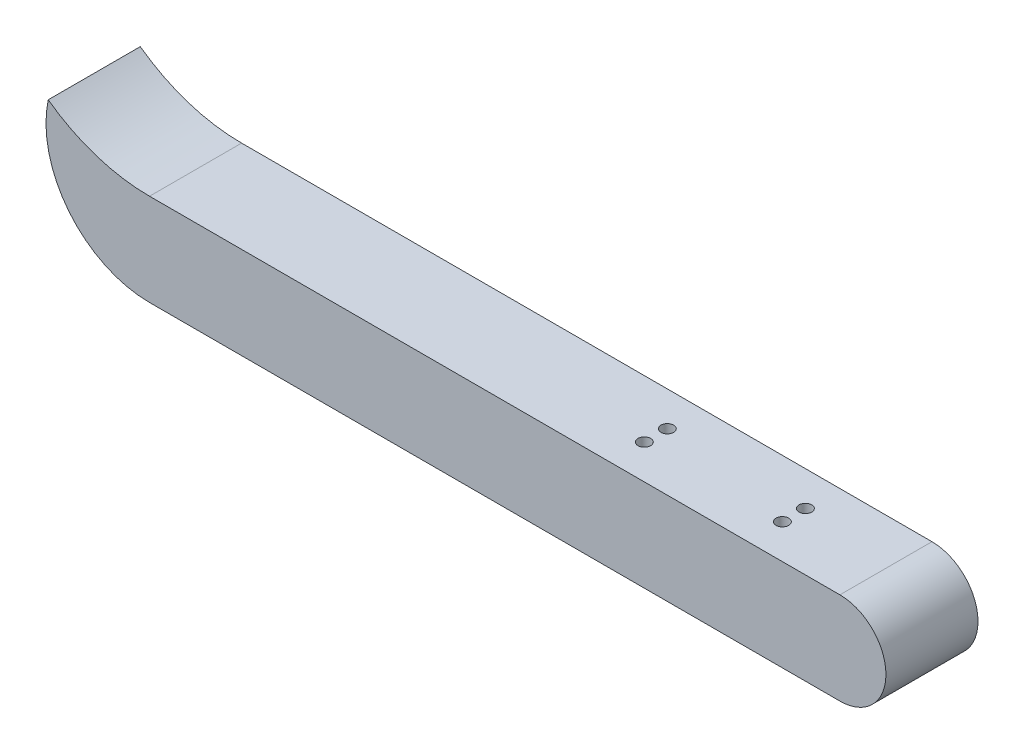
ISO-10303-21;
HEADER;
FILE_DESCRIPTION(('STEP AP214'),'2;1');
FILE_NAME('part.step','',(''),(''),'','','');
FILE_SCHEMA(('AUTOMOTIVE_DESIGN { 1 0 10303 214 1 1 1 1 }'));
ENDSEC;
DATA;
#1=APPLICATION_CONTEXT('core data for automotive mechanical design processes');
#2=APPLICATION_PROTOCOL_DEFINITION('international standard','automotive_design',2000,#1);
#3=PRODUCT_CONTEXT('',#1,'mechanical');
#4=PRODUCT('Part','Part','',(#3));
#5=PRODUCT_RELATED_PRODUCT_CATEGORY('part','',(#4));
#6=PRODUCT_DEFINITION_FORMATION('','',#4);
#7=PRODUCT_DEFINITION_CONTEXT('part definition',#1,'design');
#8=PRODUCT_DEFINITION('design','',#6,#7);
#9=PRODUCT_DEFINITION_SHAPE('','',#8);
#10=(LENGTH_UNIT() NAMED_UNIT(*) SI_UNIT(.MILLI.,.METRE.));
#11=(NAMED_UNIT(*) PLANE_ANGLE_UNIT() SI_UNIT($,.RADIAN.));
#12=(NAMED_UNIT(*) SI_UNIT($,.STERADIAN.) SOLID_ANGLE_UNIT());
#13=UNCERTAINTY_MEASURE_WITH_UNIT(LENGTH_MEASURE(1.E-05),#10,'distance_accuracy_value','');
#14=(GEOMETRIC_REPRESENTATION_CONTEXT(3) GLOBAL_UNCERTAINTY_ASSIGNED_CONTEXT((#13)) GLOBAL_UNIT_ASSIGNED_CONTEXT((#10,
#11,#12)) REPRESENTATION_CONTEXT('',''));
#15=CARTESIAN_POINT('',(0.,0.,0.));
#16=DIRECTION('',(0.,0.,1.));
#17=DIRECTION('',(1.,0.,0.));
#18=AXIS2_PLACEMENT_3D('',#15,#16,#17);
#19=CARTESIAN_POINT('',(0.,45.,40.));
#20=DIRECTION('',(0.,0.,-1.));
#21=DIRECTION('',(-1.,0.,0.));
#22=AXIS2_PLACEMENT_3D('',#19,#20,#21);
#23=CYLINDRICAL_SURFACE('',#22,45.);
#24=CARTESIAN_POINT('',(0.,45.,0.));
#25=DIRECTION('',(0.,0.,1.));
#26=DIRECTION('',(-1.,0.,0.));
#27=AXIS2_PLACEMENT_3D('',#24,#25,#26);
#28=CIRCLE('',#27,45.);
#29=CARTESIAN_POINT('',(-44.0315285926355,54.2857142857142,0.));
#30=VERTEX_POINT('',#29);
#31=CARTESIAN_POINT('',(0.,0.,0.));
#32=VERTEX_POINT('',#31);
#33=EDGE_CURVE('E167',#30,#32,#28,.T.);
#34=ORIENTED_EDGE('',*,*,#33,.T.);
#35=DIRECTION('',(0.,0.,-1.));
#36=VECTOR('',#35,1.);
#37=CARTESIAN_POINT('',(0.,0.,40.));
#38=LINE('',#37,#36);
#39=CARTESIAN_POINT('',(0.,0.,40.));
#40=VERTEX_POINT('',#39);
#41=EDGE_CURVE('E11',#40,#32,#38,.T.);
#42=ORIENTED_EDGE('',*,*,#41,.F.);
#43=CARTESIAN_POINT('',(0.,45.,40.));
#44=DIRECTION('',(0.,0.,1.));
#45=DIRECTION('',(-1.,0.,0.));
#46=AXIS2_PLACEMENT_3D('',#43,#44,#45);
#47=CIRCLE('',#46,45.);
#48=CARTESIAN_POINT('',(-44.0315285926355,54.2857142857142,40.));
#49=VERTEX_POINT('',#48);
#50=EDGE_CURVE('E154',#49,#40,#47,.T.);
#51=ORIENTED_EDGE('',*,*,#50,.F.);
#52=DIRECTION('',(0.,0.,-1.));
#53=VECTOR('',#52,1.);
#54=CARTESIAN_POINT('',(-44.0315285926355,54.2857142857142,40.));
#55=LINE('',#54,#53);
#56=EDGE_CURVE('E166',#49,#30,#55,.T.);
#57=ORIENTED_EDGE('',*,*,#56,.T.);
#58=EDGE_LOOP('',(#34,#42,#51,#57));
#59=FACE_BOUND('',#58,.T.);
#60=ADVANCED_FACE('F35',(#59),#23,.T.);
#61=CARTESIAN_POINT('',(0.,0.,40.));
#62=DIRECTION('',(0.,1.,0.));
#63=DIRECTION('',(0.,0.,1.));
#64=AXIS2_PLACEMENT_3D('',#61,#62,#63);
#65=PLANE('',#64);
#66=CARTESIAN_POINT('',(260.,0.,25.));
#67=DIRECTION('',(0.,-1.,0.));
#68=DIRECTION('',(0.,0.,-1.));
#69=AXIS2_PLACEMENT_3D('',#66,#67,#68);
#70=CIRCLE('',#69,6.12000000000001);
#71=CARTESIAN_POINT('',(263.529079200018,0.,20.));
#72=VERTEX_POINT('',#71);
#73=CARTESIAN_POINT('',(256.470920799982,0.,20.));
#74=VERTEX_POINT('',#73);
#75=EDGE_CURVE('E120',#72,#74,#70,.T.);
#76=ORIENTED_EDGE('',*,*,#75,.F.);
#77=CARTESIAN_POINT('',(260.,0.,15.));
#78=DIRECTION('',(0.,-1.,0.));
#79=DIRECTION('',(0.,0.,-1.));
#80=AXIS2_PLACEMENT_3D('',#77,#78,#79);
#81=CIRCLE('',#80,6.12000000000001);
#82=EDGE_CURVE('E113',#74,#72,#81,.T.);
#83=ORIENTED_EDGE('',*,*,#82,.F.);
#84=EDGE_LOOP('',(#76,#83));
#85=FACE_BOUND('',#84,.T.);
#86=CARTESIAN_POINT('',(200.,0.,15.));
#87=DIRECTION('',(0.,-1.,0.));
#88=DIRECTION('',(0.,0.,-1.));
#89=AXIS2_PLACEMENT_3D('',#86,#87,#88);
#90=CIRCLE('',#89,6.11999999999999);
#91=CARTESIAN_POINT('',(196.470920799982,0.,20.));
#92=VERTEX_POINT('',#91);
#93=CARTESIAN_POINT('',(203.529079200018,0.,20.));
#94=VERTEX_POINT('',#93);
#95=EDGE_CURVE('E145',#92,#94,#90,.T.);
#96=ORIENTED_EDGE('',*,*,#95,.F.);
#97=CARTESIAN_POINT('',(200.,0.,25.));
#98=DIRECTION('',(0.,-1.,0.));
#99=DIRECTION('',(0.,0.,-1.));
#100=AXIS2_PLACEMENT_3D('',#97,#98,#99);
#101=CIRCLE('',#100,6.11999999999999);
#102=EDGE_CURVE('E132',#94,#92,#101,.T.);
#103=ORIENTED_EDGE('',*,*,#102,.F.);
#104=EDGE_LOOP('',(#96,#103));
#105=FACE_BOUND('',#104,.T.);
#106=DIRECTION('',(1.,0.,0.));
#107=VECTOR('',#106,1.);
#108=CARTESIAN_POINT('',(0.,0.,0.));
#109=LINE('',#108,#107);
#110=CARTESIAN_POINT('',(300.,0.,0.));
#111=VERTEX_POINT('',#110);
#112=EDGE_CURVE('E170',#32,#111,#109,.T.);
#113=ORIENTED_EDGE('',*,*,#112,.T.);
#114=DIRECTION('',(0.,0.,-1.));
#115=VECTOR('',#114,1.);
#116=CARTESIAN_POINT('',(300.,0.,40.));
#117=LINE('',#116,#115);
#118=CARTESIAN_POINT('',(300.,0.,40.));
#119=VERTEX_POINT('',#118);
#120=EDGE_CURVE('E43',#119,#111,#117,.T.);
#121=ORIENTED_EDGE('',*,*,#120,.F.);
#122=DIRECTION('',(1.,0.,0.));
#123=VECTOR('',#122,1.);
#124=CARTESIAN_POINT('',(0.,0.,40.));
#125=LINE('',#124,#123);
#126=EDGE_CURVE('E157',#40,#119,#125,.T.);
#127=ORIENTED_EDGE('',*,*,#126,.F.);
#128=ORIENTED_EDGE('',*,*,#41,.T.);
#129=EDGE_LOOP('',(#113,#121,#127,#128));
#130=FACE_BOUND('',#129,.T.);
#131=ADVANCED_FACE('F210',(#85,#105,#130),#65,.F.);
#132=CARTESIAN_POINT('',(300.,20.,40.));
#133=DIRECTION('',(0.,0.,-1.));
#134=DIRECTION('',(-1.,0.,0.));
#135=AXIS2_PLACEMENT_3D('',#132,#133,#134);
#136=CYLINDRICAL_SURFACE('',#135,20.);
#137=CARTESIAN_POINT('',(300.,20.,0.));
#138=DIRECTION('',(0.,0.,1.));
#139=DIRECTION('',(-1.,0.,0.));
#140=AXIS2_PLACEMENT_3D('',#137,#138,#139);
#141=CIRCLE('',#140,20.);
#142=CARTESIAN_POINT('',(300.,40.,0.));
#143=VERTEX_POINT('',#142);
#144=EDGE_CURVE('E172',#111,#143,#141,.T.);
#145=ORIENTED_EDGE('',*,*,#144,.T.);
#146=DIRECTION('',(0.,0.,-1.));
#147=VECTOR('',#146,1.);
#148=CARTESIAN_POINT('',(300.,40.,40.));
#149=LINE('',#148,#147);
#150=CARTESIAN_POINT('',(300.,40.,40.));
#151=VERTEX_POINT('',#150);
#152=EDGE_CURVE('E182',#151,#143,#149,.T.);
#153=ORIENTED_EDGE('',*,*,#152,.F.);
#154=CARTESIAN_POINT('',(300.,20.,40.));
#155=DIRECTION('',(0.,0.,1.));
#156=DIRECTION('',(-1.,0.,0.));
#157=AXIS2_PLACEMENT_3D('',#154,#155,#156);
#158=CIRCLE('',#157,20.);
#159=EDGE_CURVE('E160',#119,#151,#158,.T.);
#160=ORIENTED_EDGE('',*,*,#159,.F.);
#161=ORIENTED_EDGE('',*,*,#120,.T.);
#162=EDGE_LOOP('',(#145,#153,#160,#161));
#163=FACE_BOUND('',#162,.T.);
#164=ADVANCED_FACE('F215',(#163),#136,.T.);
#165=CARTESIAN_POINT('',(0.,40.,40.));
#166=DIRECTION('',(0.,-1.,0.));
#167=DIRECTION('',(1.,0.,0.));
#168=AXIS2_PLACEMENT_3D('',#165,#166,#167);
#169=PLANE('',#168);
#170=CARTESIAN_POINT('',(260.,40.,15.));
#171=DIRECTION('',(0.,-1.,0.));
#172=DIRECTION('',(1.,0.,0.));
#173=AXIS2_PLACEMENT_3D('',#170,#171,#172);
#174=CIRCLE('',#173,2.75);
#175=CARTESIAN_POINT('',(262.75,40.,15.));
#176=VERTEX_POINT('',#175);
#177=EDGE_CURVE('E38',#176,#176,#174,.T.);
#178=ORIENTED_EDGE('',*,*,#177,.T.);
#179=EDGE_LOOP('',(#178));
#180=FACE_BOUND('',#179,.T.);
#181=CARTESIAN_POINT('',(260.,40.,25.));
#182=DIRECTION('',(0.,-1.,0.));
#183=DIRECTION('',(1.,0.,0.));
#184=AXIS2_PLACEMENT_3D('',#181,#182,#183);
#185=CIRCLE('',#184,2.75);
#186=CARTESIAN_POINT('',(262.75,40.,25.));
#187=VERTEX_POINT('',#186);
#188=EDGE_CURVE('E127',#187,#187,#185,.T.);
#189=ORIENTED_EDGE('',*,*,#188,.T.);
#190=EDGE_LOOP('',(#189));
#191=FACE_BOUND('',#190,.T.);
#192=CARTESIAN_POINT('',(200.,40.,25.));
#193=DIRECTION('',(0.,-1.,0.));
#194=DIRECTION('',(1.,0.,0.));
#195=AXIS2_PLACEMENT_3D('',#192,#193,#194);
#196=CIRCLE('',#195,2.74999999999999);
#197=CARTESIAN_POINT('',(202.75,40.,25.));
#198=VERTEX_POINT('',#197);
#199=EDGE_CURVE('E144',#198,#198,#196,.T.);
#200=ORIENTED_EDGE('',*,*,#199,.T.);
#201=EDGE_LOOP('',(#200));
#202=FACE_BOUND('',#201,.T.);
#203=CARTESIAN_POINT('',(200.,40.,15.));
#204=DIRECTION('',(0.,-1.,0.));
#205=DIRECTION('',(1.,0.,0.));
#206=AXIS2_PLACEMENT_3D('',#203,#204,#205);
#207=CIRCLE('',#206,2.74999999999999);
#208=CARTESIAN_POINT('',(202.75,40.,15.));
#209=VERTEX_POINT('',#208);
#210=EDGE_CURVE('E153',#209,#209,#207,.T.);
#211=ORIENTED_EDGE('',*,*,#210,.T.);
#212=EDGE_LOOP('',(#211));
#213=FACE_BOUND('',#212,.T.);
#214=DIRECTION('',(-1.,0.,0.));
#215=VECTOR('',#214,1.);
#216=CARTESIAN_POINT('',(0.,40.,0.));
#217=LINE('',#216,#215);
#218=CARTESIAN_POINT('',(0.,40.,0.));
#219=VERTEX_POINT('',#218);
#220=EDGE_CURVE('E174',#143,#219,#217,.T.);
#221=ORIENTED_EDGE('',*,*,#220,.T.);
#222=DIRECTION('',(0.,0.,-1.));
#223=VECTOR('',#222,1.);
#224=CARTESIAN_POINT('',(0.,40.,40.));
#225=LINE('',#224,#223);
#226=CARTESIAN_POINT('',(0.,40.,40.));
#227=VERTEX_POINT('',#226);
#228=EDGE_CURVE('E179',#227,#219,#225,.T.);
#229=ORIENTED_EDGE('',*,*,#228,.F.);
#230=DIRECTION('',(-1.,0.,0.));
#231=VECTOR('',#230,1.);
#232=CARTESIAN_POINT('',(0.,40.,40.));
#233=LINE('',#232,#231);
#234=EDGE_CURVE('E162',#151,#227,#233,.T.);
#235=ORIENTED_EDGE('',*,*,#234,.F.);
#236=ORIENTED_EDGE('',*,*,#152,.T.);
#237=EDGE_LOOP('',(#221,#229,#235,#236));
#238=FACE_BOUND('',#237,.T.);
#239=ADVANCED_FACE('F193',(#180,#191,#202,#213,#238),#169,.F.);
#240=CARTESIAN_POINT('',(0.,115.,40.));
#241=DIRECTION('',(0.,0.,-1.));
#242=DIRECTION('',(-1.,0.,0.));
#243=AXIS2_PLACEMENT_3D('',#240,#241,#242);
#244=CYLINDRICAL_SURFACE('',#243,75.);
#245=CARTESIAN_POINT('',(0.,115.,0.));
#246=DIRECTION('',(0.,0.,-1.));
#247=DIRECTION('',(-1.,0.,0.));
#248=AXIS2_PLACEMENT_3D('',#245,#246,#247);
#249=CIRCLE('',#248,75.);
#250=EDGE_CURVE('E158',#219,#30,#249,.T.);
#251=ORIENTED_EDGE('',*,*,#250,.T.);
#252=ORIENTED_EDGE('',*,*,#56,.F.);
#253=CARTESIAN_POINT('',(0.,115.,40.));
#254=DIRECTION('',(0.,0.,-1.));
#255=DIRECTION('',(-1.,0.,0.));
#256=AXIS2_PLACEMENT_3D('',#253,#254,#255);
#257=CIRCLE('',#256,75.);
#258=EDGE_CURVE('E164',#227,#49,#257,.T.);
#259=ORIENTED_EDGE('',*,*,#258,.F.);
#260=ORIENTED_EDGE('',*,*,#228,.T.);
#261=EDGE_LOOP('',(#251,#252,#259,#260));
#262=FACE_BOUND('',#261,.T.);
#263=ADVANCED_FACE('F235',(#262),#244,.F.);
#264=CARTESIAN_POINT('',(0.,45.,40.));
#265=DIRECTION('',(0.,0.,-1.));
#266=DIRECTION('',(-1.,0.,0.));
#267=AXIS2_PLACEMENT_3D('',#264,#265,#266);
#268=PLANE('',#267);
#269=ORIENTED_EDGE('',*,*,#50,.T.);
#270=ORIENTED_EDGE('',*,*,#126,.T.);
#271=ORIENTED_EDGE('',*,*,#159,.T.);
#272=ORIENTED_EDGE('',*,*,#234,.T.);
#273=ORIENTED_EDGE('',*,*,#258,.T.);
#274=EDGE_LOOP('',(#269,#270,#271,#272,#273));
#275=FACE_BOUND('',#274,.T.);
#276=ADVANCED_FACE('F230',(#275),#268,.F.);
#277=CARTESIAN_POINT('',(0.,45.,0.));
#278=DIRECTION('',(0.,0.,-1.));
#279=DIRECTION('',(-1.,0.,0.));
#280=AXIS2_PLACEMENT_3D('',#277,#278,#279);
#281=PLANE('',#280);
#282=ORIENTED_EDGE('',*,*,#33,.F.);
#283=ORIENTED_EDGE('',*,*,#250,.F.);
#284=ORIENTED_EDGE('',*,*,#220,.F.);
#285=ORIENTED_EDGE('',*,*,#144,.F.);
#286=ORIENTED_EDGE('',*,*,#112,.F.);
#287=EDGE_LOOP('',(#282,#283,#284,#285,#286));
#288=FACE_BOUND('',#287,.T.);
#289=ADVANCED_FACE('F223',(#288),#281,.T.);
#290=CARTESIAN_POINT('',(200.,0.,15.));
#291=DIRECTION('',(0.,-1.,0.));
#292=DIRECTION('',(0.,0.,-1.));
#293=AXIS2_PLACEMENT_3D('',#290,#291,#292);
#294=CYLINDRICAL_SURFACE('',#293,2.74999999999999);
#295=CARTESIAN_POINT('',(200.,3.58,15.));
#296=DIRECTION('',(0.,-1.,0.));
#297=DIRECTION('',(0.,0.,-1.));
#298=AXIS2_PLACEMENT_3D('',#295,#296,#297);
#299=CIRCLE('',#298,2.75);
#300=CARTESIAN_POINT('',(200.,3.58,12.25));
#301=VERTEX_POINT('',#300);
#302=EDGE_CURVE('E150',#301,#301,#299,.T.);
#303=ORIENTED_EDGE('',*,*,#302,.T.);
#304=EDGE_LOOP('',(#303));
#305=FACE_BOUND('',#304,.T.);
#306=ORIENTED_EDGE('',*,*,#210,.F.);
#307=EDGE_LOOP('',(#306));
#308=FACE_BOUND('',#307,.T.);
#309=ADVANCED_FACE('F251',(#305,#308),#294,.F.);
#310=CARTESIAN_POINT('',(202.75,3.58,15.));
#311=DIRECTION('',(0.,1.,0.));
#312=DIRECTION('',(0.,0.,1.));
#313=AXIS2_PLACEMENT_3D('',#310,#311,#312);
#314=PLANE('',#313);
#315=CARTESIAN_POINT('',(200.,3.58,15.));
#316=DIRECTION('',(0.,-1.,0.));
#317=DIRECTION('',(0.,0.,-1.));
#318=AXIS2_PLACEMENT_3D('',#315,#316,#317);
#319=CIRCLE('',#318,6.11999999999999);
#320=CARTESIAN_POINT('',(196.470920799982,3.58,20.));
#321=VERTEX_POINT('',#320);
#322=CARTESIAN_POINT('',(203.529079200018,3.58,20.));
#323=VERTEX_POINT('',#322);
#324=EDGE_CURVE('E148',#321,#323,#319,.T.);
#325=ORIENTED_EDGE('',*,*,#324,.T.);
#326=CARTESIAN_POINT('',(200.,3.58,25.));
#327=DIRECTION('',(0.,-1.,0.));
#328=DIRECTION('',(0.,0.,-1.));
#329=AXIS2_PLACEMENT_3D('',#326,#327,#328);
#330=CIRCLE('',#329,6.11999999999999);
#331=EDGE_CURVE('E57',#323,#321,#330,.T.);
#332=ORIENTED_EDGE('',*,*,#331,.T.);
#333=EDGE_LOOP('',(#325,#332));
#334=FACE_BOUND('',#333,.T.);
#335=ORIENTED_EDGE('',*,*,#302,.F.);
#336=EDGE_LOOP('',(#335));
#337=FACE_BOUND('',#336,.T.);
#338=CARTESIAN_POINT('',(200.,3.58,25.));
#339=DIRECTION('',(0.,-1.,0.));
#340=DIRECTION('',(0.,0.,-1.));
#341=AXIS2_PLACEMENT_3D('',#338,#339,#340);
#342=CIRCLE('',#341,2.75);
#343=CARTESIAN_POINT('',(200.,3.58,22.25));
#344=VERTEX_POINT('',#343);
#345=EDGE_CURVE('E135',#344,#344,#342,.T.);
#346=ORIENTED_EDGE('',*,*,#345,.F.);
#347=EDGE_LOOP('',(#346));
#348=FACE_BOUND('',#347,.T.);
#349=ADVANCED_FACE('F256',(#334,#337,#348),#314,.F.);
#350=CARTESIAN_POINT('',(200.,0.,15.));
#351=DIRECTION('',(0.,-1.,0.));
#352=DIRECTION('',(0.,0.,-1.));
#353=AXIS2_PLACEMENT_3D('',#350,#351,#352);
#354=CYLINDRICAL_SURFACE('',#353,6.11999999999999);
#355=ORIENTED_EDGE('',*,*,#324,.F.);
#356=DIRECTION('',(0.,-1.,0.));
#357=VECTOR('',#356,1.);
#358=CARTESIAN_POINT('',(196.470920799982,1.79,20.));
#359=LINE('',#358,#357);
#360=EDGE_CURVE('E141',#321,#92,#359,.T.);
#361=ORIENTED_EDGE('',*,*,#360,.T.);
#362=ORIENTED_EDGE('',*,*,#95,.T.);
#363=DIRECTION('',(0.,-1.,0.));
#364=VECTOR('',#363,1.);
#365=CARTESIAN_POINT('',(203.529079200018,1.79,20.));
#366=LINE('',#365,#364);
#367=EDGE_CURVE('E138',#94,#323,#366,.F.);
#368=ORIENTED_EDGE('',*,*,#367,.T.);
#369=EDGE_LOOP('',(#355,#361,#362,#368));
#370=FACE_BOUND('',#369,.T.);
#371=ADVANCED_FACE('F260',(#370),#354,.F.);
#372=CARTESIAN_POINT('',(200.,0.,25.));
#373=DIRECTION('',(0.,-1.,0.));
#374=DIRECTION('',(0.,0.,-1.));
#375=AXIS2_PLACEMENT_3D('',#372,#373,#374);
#376=CYLINDRICAL_SURFACE('',#375,2.74999999999999);
#377=ORIENTED_EDGE('',*,*,#345,.T.);
#378=EDGE_LOOP('',(#377));
#379=FACE_BOUND('',#378,.T.);
#380=ORIENTED_EDGE('',*,*,#199,.F.);
#381=EDGE_LOOP('',(#380));
#382=FACE_BOUND('',#381,.T.);
#383=ADVANCED_FACE('F206',(#379,#382),#376,.F.);
#384=CARTESIAN_POINT('',(200.,0.,25.));
#385=DIRECTION('',(0.,-1.,0.));
#386=DIRECTION('',(0.,0.,-1.));
#387=AXIS2_PLACEMENT_3D('',#384,#385,#386);
#388=CYLINDRICAL_SURFACE('',#387,6.11999999999999);
#389=ORIENTED_EDGE('',*,*,#331,.F.);
#390=ORIENTED_EDGE('',*,*,#367,.F.);
#391=ORIENTED_EDGE('',*,*,#102,.T.);
#392=ORIENTED_EDGE('',*,*,#360,.F.);
#393=EDGE_LOOP('',(#389,#390,#391,#392));
#394=FACE_BOUND('',#393,.T.);
#395=ADVANCED_FACE('F198',(#394),#388,.F.);
#396=CARTESIAN_POINT('',(260.,0.,25.));
#397=DIRECTION('',(0.,-1.,0.));
#398=DIRECTION('',(0.,0.,-1.));
#399=AXIS2_PLACEMENT_3D('',#396,#397,#398);
#400=CYLINDRICAL_SURFACE('',#399,2.75);
#401=CARTESIAN_POINT('',(260.,3.58,25.));
#402=DIRECTION('',(0.,-1.,0.));
#403=DIRECTION('',(0.,0.,-1.));
#404=AXIS2_PLACEMENT_3D('',#401,#402,#403);
#405=CIRCLE('',#404,2.75000000000003);
#406=CARTESIAN_POINT('',(260.,3.58,22.25));
#407=VERTEX_POINT('',#406);
#408=EDGE_CURVE('E124',#407,#407,#405,.T.);
#409=ORIENTED_EDGE('',*,*,#408,.T.);
#410=EDGE_LOOP('',(#409));
#411=FACE_BOUND('',#410,.T.);
#412=ORIENTED_EDGE('',*,*,#188,.F.);
#413=EDGE_LOOP('',(#412));
#414=FACE_BOUND('',#413,.T.);
#415=ADVANCED_FACE('F196',(#411,#414),#400,.F.);
#416=CARTESIAN_POINT('',(262.75,3.58,25.));
#417=DIRECTION('',(0.,1.,0.));
#418=DIRECTION('',(0.,0.,1.));
#419=AXIS2_PLACEMENT_3D('',#416,#417,#418);
#420=PLANE('',#419);
#421=CARTESIAN_POINT('',(260.,3.58,25.));
#422=DIRECTION('',(0.,-1.,0.));
#423=DIRECTION('',(0.,0.,-1.));
#424=AXIS2_PLACEMENT_3D('',#421,#422,#423);
#425=CIRCLE('',#424,6.12000000000001);
#426=CARTESIAN_POINT('',(263.529079200018,3.58,20.));
#427=VERTEX_POINT('',#426);
#428=CARTESIAN_POINT('',(256.470920799982,3.58,20.));
#429=VERTEX_POINT('',#428);
#430=EDGE_CURVE('E118',#427,#429,#425,.T.);
#431=ORIENTED_EDGE('',*,*,#430,.T.);
#432=CARTESIAN_POINT('',(260.,3.58,15.));
#433=DIRECTION('',(0.,-1.,0.));
#434=DIRECTION('',(0.,0.,-1.));
#435=AXIS2_PLACEMENT_3D('',#432,#433,#434);
#436=CIRCLE('',#435,6.12000000000001);
#437=EDGE_CURVE('E50',#429,#427,#436,.T.);
#438=ORIENTED_EDGE('',*,*,#437,.T.);
#439=EDGE_LOOP('',(#431,#438));
#440=FACE_BOUND('',#439,.T.);
#441=ORIENTED_EDGE('',*,*,#408,.F.);
#442=EDGE_LOOP('',(#441));
#443=FACE_BOUND('',#442,.T.);
#444=CARTESIAN_POINT('',(260.,3.58,15.));
#445=DIRECTION('',(0.,-1.,0.));
#446=DIRECTION('',(0.,0.,-1.));
#447=AXIS2_PLACEMENT_3D('',#444,#445,#446);
#448=CIRCLE('',#447,2.75000000000003);
#449=CARTESIAN_POINT('',(260.,3.58,12.25));
#450=VERTEX_POINT('',#449);
#451=EDGE_CURVE('E112',#450,#450,#448,.T.);
#452=ORIENTED_EDGE('',*,*,#451,.F.);
#453=EDGE_LOOP('',(#452));
#454=FACE_BOUND('',#453,.T.);
#455=ADVANCED_FACE('F122',(#440,#443,#454),#420,.F.);
#456=CARTESIAN_POINT('',(260.,0.,25.));
#457=DIRECTION('',(0.,-1.,0.));
#458=DIRECTION('',(0.,0.,-1.));
#459=AXIS2_PLACEMENT_3D('',#456,#457,#458);
#460=CYLINDRICAL_SURFACE('',#459,6.12000000000001);
#461=ORIENTED_EDGE('',*,*,#430,.F.);
#462=DIRECTION('',(0.,-1.,0.));
#463=VECTOR('',#462,1.);
#464=CARTESIAN_POINT('',(263.529079200018,1.79,20.));
#465=LINE('',#464,#463);
#466=EDGE_CURVE('E110',#427,#72,#465,.T.);
#467=ORIENTED_EDGE('',*,*,#466,.T.);
#468=ORIENTED_EDGE('',*,*,#75,.T.);
#469=DIRECTION('',(0.,-1.,0.));
#470=VECTOR('',#469,1.);
#471=CARTESIAN_POINT('',(256.470920799982,1.79,20.));
#472=LINE('',#471,#470);
#473=EDGE_CURVE('E107',#74,#429,#472,.F.);
#474=ORIENTED_EDGE('',*,*,#473,.T.);
#475=EDGE_LOOP('',(#461,#467,#468,#474));
#476=FACE_BOUND('',#475,.T.);
#477=ADVANCED_FACE('F117',(#476),#460,.F.);
#478=CARTESIAN_POINT('',(260.,0.,15.));
#479=DIRECTION('',(0.,-1.,0.));
#480=DIRECTION('',(0.,0.,-1.));
#481=AXIS2_PLACEMENT_3D('',#478,#479,#480);
#482=CYLINDRICAL_SURFACE('',#481,2.75);
#483=ORIENTED_EDGE('',*,*,#451,.T.);
#484=EDGE_LOOP('',(#483));
#485=FACE_BOUND('',#484,.T.);
#486=ORIENTED_EDGE('',*,*,#177,.F.);
#487=EDGE_LOOP('',(#486));
#488=FACE_BOUND('',#487,.T.);
#489=ADVANCED_FACE('F301',(#485,#488),#482,.F.);
#490=CARTESIAN_POINT('',(260.,0.,15.));
#491=DIRECTION('',(0.,-1.,0.));
#492=DIRECTION('',(0.,0.,-1.));
#493=AXIS2_PLACEMENT_3D('',#490,#491,#492);
#494=CYLINDRICAL_SURFACE('',#493,6.12000000000001);
#495=ORIENTED_EDGE('',*,*,#437,.F.);
#496=ORIENTED_EDGE('',*,*,#473,.F.);
#497=ORIENTED_EDGE('',*,*,#82,.T.);
#498=ORIENTED_EDGE('',*,*,#466,.F.);
#499=EDGE_LOOP('',(#495,#496,#497,#498));
#500=FACE_BOUND('',#499,.T.);
#501=ADVANCED_FACE('F106',(#500),#494,.F.);
#502=CLOSED_SHELL('',(#60,#131,#164,#239,#263,#276,#289,#309,#349,#371,#383,#395,#415,#455,#477,
#489,#501));
#503=MANIFOLD_SOLID_BREP('B2',#502);
#504=ADVANCED_BREP_SHAPE_REPRESENTATION('',(#18,#503),#14);
#505=SHAPE_DEFINITION_REPRESENTATION(#9,#504);
ENDSEC;
END-ISO-10303-21;
